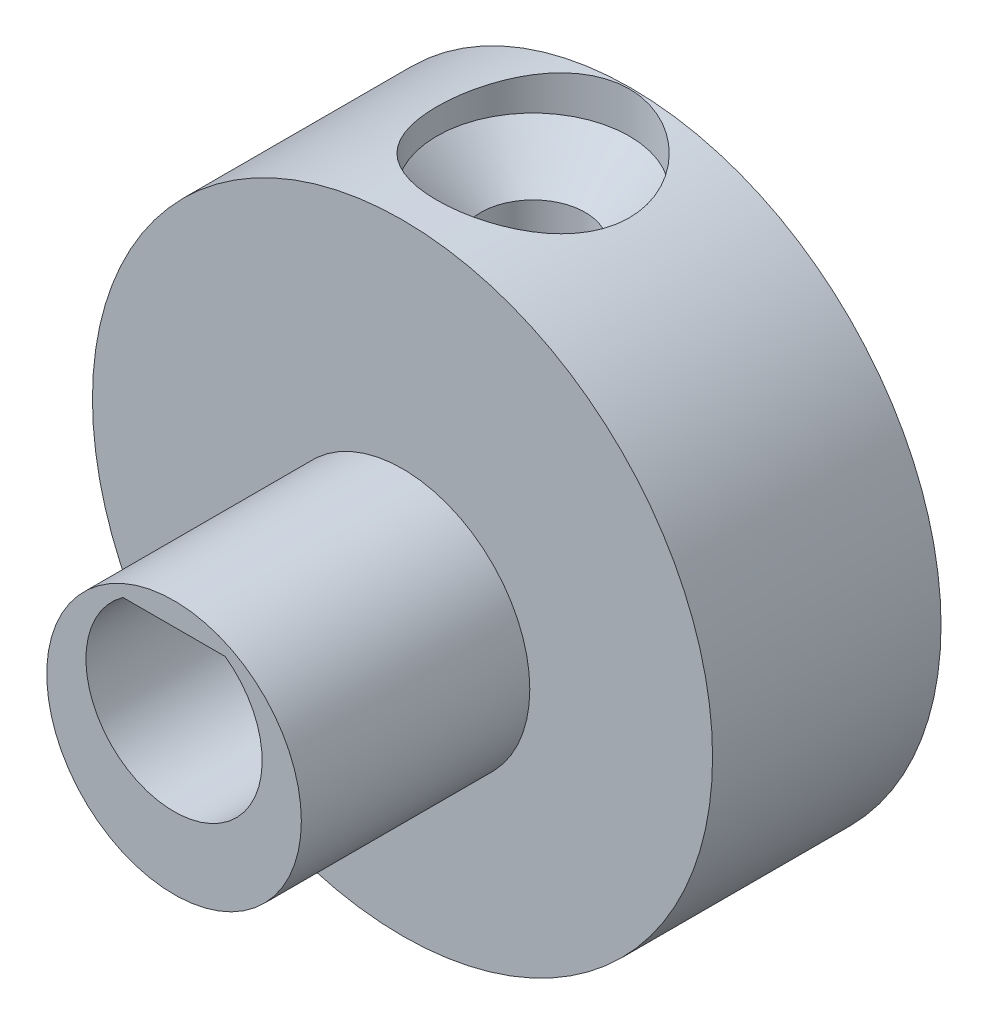
ISO-10303-21;
HEADER;
FILE_DESCRIPTION(('STEP AP214'),'2;1');
FILE_NAME('part.step','',(''),(''),'','','');
FILE_SCHEMA(('AUTOMOTIVE_DESIGN { 1 0 10303 214 1 1 1 1 }'));
ENDSEC;
DATA;
#1=APPLICATION_CONTEXT('core data for automotive mechanical design processes');
#2=APPLICATION_PROTOCOL_DEFINITION('international standard','automotive_design',2000,#1);
#3=PRODUCT_CONTEXT('',#1,'mechanical');
#4=PRODUCT('Part','Part','',(#3));
#5=PRODUCT_RELATED_PRODUCT_CATEGORY('part','',(#4));
#6=PRODUCT_DEFINITION_FORMATION('','',#4);
#7=PRODUCT_DEFINITION_CONTEXT('part definition',#1,'design');
#8=PRODUCT_DEFINITION('design','',#6,#7);
#9=PRODUCT_DEFINITION_SHAPE('','',#8);
#10=(LENGTH_UNIT() NAMED_UNIT(*) SI_UNIT(.MILLI.,.METRE.));
#11=(NAMED_UNIT(*) PLANE_ANGLE_UNIT() SI_UNIT($,.RADIAN.));
#12=(NAMED_UNIT(*) SI_UNIT($,.STERADIAN.) SOLID_ANGLE_UNIT());
#13=UNCERTAINTY_MEASURE_WITH_UNIT(LENGTH_MEASURE(1.E-05),#10,'distance_accuracy_value','');
#14=(GEOMETRIC_REPRESENTATION_CONTEXT(3) GLOBAL_UNCERTAINTY_ASSIGNED_CONTEXT((#13)) GLOBAL_UNIT_ASSIGNED_CONTEXT((#10,
#11,#12)) REPRESENTATION_CONTEXT('',''));
#15=CARTESIAN_POINT('',(0.,0.,0.));
#16=DIRECTION('',(0.,0.,1.));
#17=DIRECTION('',(1.,0.,0.));
#18=AXIS2_PLACEMENT_3D('',#15,#16,#17);
#19=CARTESIAN_POINT('',(0.,0.,7.));
#20=DIRECTION('',(0.,0.,1.));
#21=DIRECTION('',(1.,0.,0.));
#22=AXIS2_PLACEMENT_3D('',#19,#20,#21);
#23=PLANE('',#22);
#24=CARTESIAN_POINT('',(0.,0.,7.));
#25=DIRECTION('',(0.,0.,1.));
#26=DIRECTION('',(1.,0.,0.));
#27=AXIS2_PLACEMENT_3D('',#24,#25,#26);
#28=CIRCLE('',#27,9.5);
#29=CARTESIAN_POINT('',(9.5,0.,7.));
#30=VERTEX_POINT('',#29);
#31=EDGE_CURVE('E239',#30,#30,#28,.T.);
#32=ORIENTED_EDGE('',*,*,#31,.T.);
#33=EDGE_LOOP('',(#32));
#34=FACE_BOUND('',#33,.T.);
#35=CARTESIAN_POINT('',(0.,-1.,7.));
#36=DIRECTION('',(0.,0.,1.));
#37=DIRECTION('',(1.,0.,0.));
#38=AXIS2_PLACEMENT_3D('',#35,#36,#37);
#39=CIRCLE('',#38,3.9);
#40=CARTESIAN_POINT('',(3.9,-1.,7.));
#41=VERTEX_POINT('',#40);
#42=EDGE_CURVE('E121',#41,#41,#39,.T.);
#43=ORIENTED_EDGE('',*,*,#42,.F.);
#44=EDGE_LOOP('',(#43));
#45=FACE_BOUND('',#44,.T.);
#46=ADVANCED_FACE('F37',(#34,#45),#23,.T.);
#47=CARTESIAN_POINT('',(0.,0.,7.));
#48=DIRECTION('',(0.,0.,-1.));
#49=DIRECTION('',(-1.,0.,0.));
#50=AXIS2_PLACEMENT_3D('',#47,#48,#49);
#51=CYLINDRICAL_SURFACE('',#50,9.5);
#52=CARTESIAN_POINT('',(0.,0.,0.));
#53=DIRECTION('',(0.,0.,1.));
#54=DIRECTION('',(1.,0.,0.));
#55=AXIS2_PLACEMENT_3D('',#52,#53,#54);
#56=CIRCLE('',#55,9.5);
#57=CARTESIAN_POINT('',(9.5,0.,0.));
#58=VERTEX_POINT('',#57);
#59=EDGE_CURVE('E243',#58,#58,#56,.T.);
#60=ORIENTED_EDGE('',*,*,#59,.T.);
#61=EDGE_LOOP('',(#60));
#62=FACE_BOUND('',#61,.T.);
#63=ORIENTED_EDGE('',*,*,#31,.F.);
#64=EDGE_LOOP('',(#63));
#65=FACE_BOUND('',#64,.T.);
#66=CARTESIAN_POINT('',(0.,9.5,0.0499999999999993));
#67=CARTESIAN_POINT('',(-0.161567406926282,9.49999909437013,0.0500012053630499));
#68=CARTESIAN_POINT('',(-0.323147279900732,9.49583932646089,0.0633170152733178));
#69=CARTESIAN_POINT('',(-0.641584944667411,9.4796525446316,0.116090940860596));
#70=CARTESIAN_POINT('',(-0.798441604267729,9.46762365987992,0.155555273208378));
#71=CARTESIAN_POINT('',(-1.1027947170735,9.43701334908745,0.259169398645543));
#72=CARTESIAN_POINT('',(-1.25030514697856,9.41844199348971,0.323281266989727));
#73=CARTESIAN_POINT('',(-1.53248201206492,9.3766662966487,0.474210142770418));
#74=CARTESIAN_POINT('',(-1.66714646842867,9.35346124331958,0.561030640603282));
#75=CARTESIAN_POINT('',(-1.92392164602274,9.30409066859077,0.757703607749757));
#76=CARTESIAN_POINT('',(-2.04558497174894,9.27786125549183,0.86812409803955));
#77=CARTESIAN_POINT('',(-2.26899843351921,9.22577001109754,1.10765299045519));
#78=CARTESIAN_POINT('',(-2.37074492095983,9.19990824795588,1.23676480915913));
#79=CARTESIAN_POINT('',(-2.55385091036749,9.15079643620819,1.51387042991636));
#80=CARTESIAN_POINT('',(-2.63465356334744,9.12762533185938,1.66224750371649));
#81=CARTESIAN_POINT('',(-2.76997388856631,9.0874783497526,1.97132013600399));
#82=CARTESIAN_POINT('',(-2.82449838589876,9.07050086363595,2.13201248332678));
#83=CARTESIAN_POINT('',(-2.90408138455997,9.04533128254273,2.45610954895438));
#84=CARTESIAN_POINT('',(-2.92996899453239,9.03689262508304,2.61929099891351));
#85=CARTESIAN_POINT('',(-2.95413341495907,9.02902387054017,2.94788242785283));
#86=CARTESIAN_POINT('',(-2.95241746001743,9.02959141302616,3.11329181155979));
#87=CARTESIAN_POINT('',(-2.92207237656135,9.03945315294141,3.43480411513528));
#88=CARTESIAN_POINT('',(-2.89449475789453,9.0484063790988,3.59101849420595));
#89=CARTESIAN_POINT('',(-2.81491309113067,9.07347713419755,3.89648344363991));
#90=CARTESIAN_POINT('',(-2.7629064768515,9.08959541579385,4.04573328059079));
#91=CARTESIAN_POINT('',(-2.6351954260975,9.12744320307038,4.33554814067386));
#92=CARTESIAN_POINT('',(-2.55915907832293,9.14925050349878,4.47595630717615));
#93=CARTESIAN_POINT('',(-2.38577749205108,9.19598327284839,4.74236659799241));
#94=CARTESIAN_POINT('',(-2.28842677694271,9.2209095424652,4.86836500710723));
#95=CARTESIAN_POINT('',(-2.07001007189237,9.27244196952574,5.10832688880689));
#96=CARTESIAN_POINT('',(-1.94807528955188,9.2990732934929,5.22149560969989));
#97=CARTESIAN_POINT('',(-1.68662683083102,9.35002696614506,5.42597041988933));
#98=CARTESIAN_POINT('',(-1.54711188578235,9.37434914796901,5.51727492997958));
#99=CARTESIAN_POINT('',(-1.25294578630071,9.41819399659606,5.67595898257887));
#100=CARTESIAN_POINT('',(-1.09818748558625,9.43767871491492,5.74315109193124));
#101=CARTESIAN_POINT('',(-0.778819183350298,9.4693793851044,5.85031348531666));
#102=CARTESIAN_POINT('',(-0.61421215015672,9.48159751504087,5.89029192681445));
#103=CARTESIAN_POINT('',(-0.28656667679164,9.49703883611712,5.94054324107595));
#104=CARTESIAN_POINT('',(-0.123708384939485,9.50058770760766,5.95189220732163));
#105=CARTESIAN_POINT('',(0.201601932367692,9.49925262326359,5.94759358362796));
#106=CARTESIAN_POINT('',(0.364054012967164,9.4943698821311,5.93194988239348));
#107=CARTESIAN_POINT('',(0.67980412116065,9.47693408259223,5.87497489716199));
#108=CARTESIAN_POINT('',(0.833228898815433,9.46457179594631,5.83428207522708));
#109=CARTESIAN_POINT('',(1.13103193920231,9.4336206935061,5.7291412739831));
#110=CARTESIAN_POINT('',(1.27540908642626,9.41503111171676,5.66469037218818));
#111=CARTESIAN_POINT('',(1.55490183062599,9.3729797560398,5.51211894904669));
#112=CARTESIAN_POINT('',(1.6897089552774,9.34941101330813,5.42346363383942));
#113=CARTESIAN_POINT('',(1.9428945614532,9.30009814128056,5.22564291445676));
#114=CARTESIAN_POINT('',(2.06126862591042,9.27435343008295,5.1164720143543));
#115=CARTESIAN_POINT('',(2.28303028563283,9.22232431241009,4.87565846835638));
#116=CARTESIAN_POINT('',(2.38565110769751,9.19605815233821,4.74330417602472));
#117=CARTESIAN_POINT('',(2.56729230566239,9.14701551450581,4.46268265243309));
#118=CARTESIAN_POINT('',(2.64631309948734,9.12423897495228,4.31441570302807));
#119=CARTESIAN_POINT('',(2.77801107540274,9.08500886999748,4.00651251503136));
#120=CARTESIAN_POINT('',(2.83079392351569,9.06853000553508,3.84692488633395));
#121=CARTESIAN_POINT('',(2.90855420077247,9.04389344036225,3.52051181246741));
#122=CARTESIAN_POINT('',(2.93354203890362,9.03573262471139,3.35368910110678));
#123=CARTESIAN_POINT('',(2.95426179319509,9.02897791996795,3.02554898737811));
#124=CARTESIAN_POINT('',(2.95125029876885,9.02997309506265,2.86431839924569));
#125=CARTESIAN_POINT('',(2.91908487827771,9.04042161312564,2.54477982436118));
#126=CARTESIAN_POINT('',(2.88993214312725,9.04987457078336,2.38647170480572));
#127=CARTESIAN_POINT('',(2.80714823120982,9.07588821023991,2.07948785820325));
#128=CARTESIAN_POINT('',(2.75387232038773,9.09234553343246,1.93070690918572));
#129=CARTESIAN_POINT('',(2.62463355858462,9.13048834385641,1.64407670566368));
#130=CARTESIAN_POINT('',(2.54866613484505,9.1521748847017,1.50622966163536));
#131=CARTESIAN_POINT('',(2.37276215352555,9.1993796473737,1.23960680207983));
#132=CARTESIAN_POINT('',(2.27201185566098,9.22501366488037,1.11138839752195));
#133=CARTESIAN_POINT('',(2.05083918353012,9.27668784829,0.873271156410551));
#134=CARTESIAN_POINT('',(1.9304115734831,9.30272812061747,0.763377211435582));
#135=CARTESIAN_POINT('',(1.66865147411401,9.35328327344975,0.561500126401841));
#136=CARTESIAN_POINT('',(1.52677209182646,9.37772237221401,0.470205038009916));
#137=CARTESIAN_POINT('',(1.22892069533783,9.42137753490286,0.312884259051782));
#138=CARTESIAN_POINT('',(1.07295442414725,9.44059571462425,0.246848327678644));
#139=CARTESIAN_POINT('',(0.765560445769293,9.47024941398984,0.146897702763779));
#140=CARTESIAN_POINT('',(0.614944492264324,9.48130976925064,0.110664734584473));
#141=CARTESIAN_POINT('',(0.309555624634414,9.49618478460592,0.0622176642378099));
#142=CARTESIAN_POINT('',(0.154783532906983,9.50000086760438,0.0499988452475961));
#143=CARTESIAN_POINT('',(0.,9.5,0.0499999999999993));
#144=B_SPLINE_CURVE_WITH_KNOTS('',3,(#66,#67,#68,#69,#70,#71,#72,#73,#74,#75,#76,#77,#78,#79,
#80,#81,#82,#83,#84,#85,#86,#87,#88,#89,#90,#91,#92,#93,#94,#95,#96,#97,#98,#99,#100,#101,#102,
#103,#104,#105,#106,#107,#108,#109,#110,#111,#112,#113,#114,#115,#116,#117,#118,#119,#120,#121,
#122,#123,#124,#125,#126,#127,#128,#129,#130,#131,#132,#133,#134,#135,#136,#137,#138,#139,#140,
#141,#142,#143),.UNSPECIFIED.,.T.,.F.,(4,2,2,2,2,2,2,2,2,2,2,2,2,2,2,2,2,2,2,2,2,2,2,2,2,2,2,2,
2,2,2,2,2,2,2,2,2,2,4),(0.,0.484133347649746,0.96838183672198,1.45188818389918,1.9354688914219,
2.43235600900798,2.92933406727785,3.43841546523622,3.94736457068723,4.4411578270051,
4.93482166741193,5.40924564801404,5.88371947637557,6.3650566535253,6.8465176530991,
7.34960385933532,7.85272639148277,8.3596792068509,8.86647999298948,9.35392709509123,
9.84130397887705,10.3167451742589,10.7922448732782,11.2792455126031,11.7663768011586,
12.2725515232061,12.7787172810488,13.2828277399315,13.7867493502464,14.2681684586811,
14.7495656362578,15.2240928552618,15.6987157648444,16.1917042316329,16.6848240880873,
17.1937707021137,17.7025107549165,18.1664074932947,18.6302131046672),.UNSPECIFIED.);
#145=CARTESIAN_POINT('',(0.,9.5,0.0499999999999993));
#146=VERTEX_POINT('',#145);
#147=EDGE_CURVE('E114',#146,#146,#144,.T.);
#148=ORIENTED_EDGE('',*,*,#147,.F.);
#149=EDGE_LOOP('',(#148));
#150=FACE_BOUND('',#149,.T.);
#151=ADVANCED_FACE('F175',(#62,#65,#150),#51,.T.);
#152=CARTESIAN_POINT('',(0.,9.501,3.));
#153=DIRECTION('',(0.,-1.,0.));
#154=DIRECTION('',(0.,0.,-1.));
#155=AXIS2_PLACEMENT_3D('',#152,#153,#154);
#156=CYLINDRICAL_SURFACE('',#155,1.6);
#157=CARTESIAN_POINT('',(0.,6.89999999999996,3.));
#158=DIRECTION('',(0.,1.,0.));
#159=DIRECTION('',(0.,0.,1.));
#160=AXIS2_PLACEMENT_3D('',#157,#158,#159);
#161=CIRCLE('',#160,1.6);
#162=CARTESIAN_POINT('',(0.,6.89999999999996,4.6));
#163=VERTEX_POINT('',#162);
#164=EDGE_CURVE('E46',#163,#163,#161,.T.);
#165=ORIENTED_EDGE('',*,*,#164,.T.);
#166=EDGE_LOOP('',(#165));
#167=FACE_BOUND('',#166,.T.);
#168=CARTESIAN_POINT('',(0.,5.6,3.));
#169=DIRECTION('',(0.,1.,0.));
#170=DIRECTION('',(0.,0.,1.));
#171=AXIS2_PLACEMENT_3D('',#168,#169,#170);
#172=CIRCLE('',#171,1.6);
#173=CARTESIAN_POINT('',(0.,5.6,4.6));
#174=VERTEX_POINT('',#173);
#175=EDGE_CURVE('E131',#174,#174,#172,.T.);
#176=ORIENTED_EDGE('',*,*,#175,.F.);
#177=EDGE_LOOP('',(#176));
#178=FACE_BOUND('',#177,.T.);
#179=ADVANCED_FACE('F183',(#167,#178),#156,.F.);
#180=CARTESIAN_POINT('',(0.,2.2,7.));
#181=DIRECTION('',(0.,1.,0.));
#182=DIRECTION('',(0.,0.,1.));
#183=AXIS2_PLACEMENT_3D('',#180,#181,#182);
#184=PLANE('',#183);
#185=DIRECTION('',(0.,0.,-1.));
#186=VECTOR('',#185,1.);
#187=CARTESIAN_POINT('',(1.56524758424985,2.2,7.));
#188=LINE('',#187,#186);
#189=CARTESIAN_POINT('',(1.56524758424985,2.2,2.66833752096446));
#190=VERTEX_POINT('',#189);
#191=CARTESIAN_POINT('',(1.56524758424985,2.2,0.));
#192=VERTEX_POINT('',#191);
#193=EDGE_CURVE('E242',#190,#192,#188,.T.);
#194=ORIENTED_EDGE('',*,*,#193,.F.);
#195=CARTESIAN_POINT('',(0.,2.2,3.));
#196=DIRECTION('',(0.,1.,0.));
#197=DIRECTION('',(0.,0.,1.));
#198=AXIS2_PLACEMENT_3D('',#195,#196,#197);
#199=CIRCLE('',#198,1.6);
#200=CARTESIAN_POINT('',(-1.56524758424985,2.2,2.66833752096446));
#201=VERTEX_POINT('',#200);
#202=EDGE_CURVE('E386',#201,#190,#199,.F.);
#203=ORIENTED_EDGE('',*,*,#202,.F.);
#204=DIRECTION('',(0.,0.,-1.));
#205=VECTOR('',#204,1.);
#206=CARTESIAN_POINT('',(-1.56524758424985,2.2,7.));
#207=LINE('',#206,#205);
#208=CARTESIAN_POINT('',(-1.56524758424985,2.2,0.));
#209=VERTEX_POINT('',#208);
#210=EDGE_CURVE('E115',#201,#209,#207,.T.);
#211=ORIENTED_EDGE('',*,*,#210,.T.);
#212=DIRECTION('',(1.,0.,0.));
#213=VECTOR('',#212,1.);
#214=CARTESIAN_POINT('',(0.,2.2,0.));
#215=LINE('',#214,#213);
#216=EDGE_CURVE('E246',#209,#192,#215,.T.);
#217=ORIENTED_EDGE('',*,*,#216,.T.);
#218=EDGE_LOOP('',(#194,#203,#211,#217));
#219=FACE_BOUND('',#218,.T.);
#220=ADVANCED_FACE('F200',(#219),#184,.F.);
#221=CARTESIAN_POINT('',(0.,0.,7.));
#222=DIRECTION('',(0.,0.,-1.));
#223=DIRECTION('',(-1.,0.,0.));
#224=AXIS2_PLACEMENT_3D('',#221,#222,#223);
#225=CYLINDRICAL_SURFACE('',#224,2.7);
#226=CARTESIAN_POINT('',(-1.56524758424985,2.2,2.66833752096446));
#227=CARTESIAN_POINT('',(-1.57292963429452,2.19452808663043,2.70456186670789));
#228=CARTESIAN_POINT('',(-1.57936917128531,2.18989180592703,2.74118363505691));
#229=CARTESIAN_POINT('',(-1.5897018997922,2.18240605147891,2.81498245276267));
#230=CARTESIAN_POINT('',(-1.59359384556162,2.17955745192049,2.85215976470022));
#231=CARTESIAN_POINT('',(-1.59870735636453,2.1758085620884,2.92599880128177));
#232=CARTESIAN_POINT('',(-1.5999840712512,2.17486803859762,2.96265462539391));
#233=CARTESIAN_POINT('',(-1.60001562405347,2.17484482043315,3.0359488036478));
#234=CARTESIAN_POINT('',(-1.59877177873663,2.17576115571661,3.07258715691501));
#235=CARTESIAN_POINT('',(-1.59372408946355,2.17946217006362,3.14643516984341));
#236=CARTESIAN_POINT('',(-1.58986229458151,2.18228913851785,3.18363870807796));
#237=CARTESIAN_POINT('',(-1.57952635642709,2.18977849818965,3.25792201434403));
#238=CARTESIAN_POINT('',(-1.57302360387628,2.19446097604557,3.29499579154589));
#239=CARTESIAN_POINT('',(-1.56524758424985,2.2,3.33166247903554));
#240=B_SPLINE_CURVE_WITH_KNOTS('',3,(#226,#227,#228,#229,#230,#231,#232,#233,#234,#235,#236,
#237,#238,#239),.UNSPECIFIED.,.F.,.F.,(4,2,2,2,2,2,4),(0.,0.112276021034318,0.224606902990104,
0.334543500973395,0.44442268171029,0.556817184440531,0.670463181993472),.UNSPECIFIED.);
#241=CARTESIAN_POINT('',(-1.56524758424985,2.2,3.33166247903554));
#242=VERTEX_POINT('',#241);
#243=EDGE_CURVE('E112',#201,#242,#240,.T.);
#244=ORIENTED_EDGE('',*,*,#243,.T.);
#245=CARTESIAN_POINT('',(-1.56524758424985,2.2,14.));
#246=VERTEX_POINT('',#245);
#247=EDGE_CURVE('E104',#246,#242,#207,.T.);
#248=ORIENTED_EDGE('',*,*,#247,.F.);
#249=CARTESIAN_POINT('',(0.,0.,14.));
#250=DIRECTION('',(0.,0.,1.));
#251=DIRECTION('',(1.,0.,0.));
#252=AXIS2_PLACEMENT_3D('',#249,#250,#251);
#253=CIRCLE('',#252,2.7);
#254=CARTESIAN_POINT('',(1.56524758424985,2.2,14.));
#255=VERTEX_POINT('',#254);
#256=EDGE_CURVE('E109',#246,#255,#253,.T.);
#257=ORIENTED_EDGE('',*,*,#256,.T.);
#258=CARTESIAN_POINT('',(1.56524758424985,2.2,3.33166247903554));
#259=VERTEX_POINT('',#258);
#260=EDGE_CURVE('E119',#255,#259,#188,.T.);
#261=ORIENTED_EDGE('',*,*,#260,.T.);
#262=CARTESIAN_POINT('',(1.56524758424985,2.2,3.33166247903554));
#263=CARTESIAN_POINT('',(1.57292963429452,2.19452808663043,3.29543813329211));
#264=CARTESIAN_POINT('',(1.57936917128531,2.18989180592703,3.25881636494309));
#265=CARTESIAN_POINT('',(1.5897018997922,2.18240605147891,3.18501754723733));
#266=CARTESIAN_POINT('',(1.59359384556162,2.17955745192049,3.14784023529978));
#267=CARTESIAN_POINT('',(1.59870735636453,2.1758085620884,3.07400119871823));
#268=CARTESIAN_POINT('',(1.5999840712512,2.17486803859762,3.03734537460609));
#269=CARTESIAN_POINT('',(1.60001562405347,2.17484482043315,2.9640511963522));
#270=CARTESIAN_POINT('',(1.59877177873663,2.17576115571661,2.92741284308499));
#271=CARTESIAN_POINT('',(1.59372408946355,2.17946217006362,2.85356483015659));
#272=CARTESIAN_POINT('',(1.58986229458151,2.18228913851785,2.81636129192204));
#273=CARTESIAN_POINT('',(1.57952635642709,2.18977849818965,2.74207798565597));
#274=CARTESIAN_POINT('',(1.57302360387628,2.19446097604557,2.70500420845411));
#275=CARTESIAN_POINT('',(1.56524758424985,2.2,2.66833752096446));
#276=B_SPLINE_CURVE_WITH_KNOTS('',3,(#262,#263,#264,#265,#266,#267,#268,#269,#270,#271,#272,
#273,#274,#275),.UNSPECIFIED.,.F.,.F.,(4,2,2,2,2,2,4),(0.,0.112276021034318,0.224606902990104,
0.334543500973395,0.44442268171029,0.556817184440528,0.670463181993466),.UNSPECIFIED.);
#277=EDGE_CURVE('E53',#259,#190,#276,.T.);
#278=ORIENTED_EDGE('',*,*,#277,.T.);
#279=ORIENTED_EDGE('',*,*,#193,.T.);
#280=CARTESIAN_POINT('',(0.,0.,0.));
#281=DIRECTION('',(0.,0.,1.));
#282=DIRECTION('',(1.,0.,0.));
#283=AXIS2_PLACEMENT_3D('',#280,#281,#282);
#284=CIRCLE('',#283,2.7);
#285=EDGE_CURVE('E233',#209,#192,#284,.T.);
#286=ORIENTED_EDGE('',*,*,#285,.F.);
#287=ORIENTED_EDGE('',*,*,#210,.F.);
#288=EDGE_LOOP('',(#244,#248,#257,#261,#278,#279,#286,#287));
#289=FACE_BOUND('',#288,.T.);
#290=ADVANCED_FACE('F106',(#289),#225,.F.);
#291=ORIENTED_EDGE('',*,*,#247,.T.);
#292=EDGE_CURVE('E134',#259,#242,#199,.F.);
#293=ORIENTED_EDGE('',*,*,#292,.F.);
#294=ORIENTED_EDGE('',*,*,#260,.F.);
#295=DIRECTION('',(-1.,0.,0.));
#296=VECTOR('',#295,1.);
#297=CARTESIAN_POINT('',(-1.56524758424985,2.2,14.));
#298=LINE('',#297,#296);
#299=EDGE_CURVE('E117',#255,#246,#298,.T.);
#300=ORIENTED_EDGE('',*,*,#299,.T.);
#301=EDGE_LOOP('',(#291,#293,#294,#300));
#302=FACE_BOUND('',#301,.T.);
#303=ADVANCED_FACE('F118',(#302),#184,.F.);
#304=CARTESIAN_POINT('',(0.,0.,0.));
#305=DIRECTION('',(0.,0.,1.));
#306=DIRECTION('',(1.,0.,0.));
#307=AXIS2_PLACEMENT_3D('',#304,#305,#306);
#308=PLANE('',#307);
#309=DIRECTION('',(1.,0.,0.));
#310=VECTOR('',#309,1.);
#311=CARTESIAN_POINT('',(2.9,5.6,0.));
#312=LINE('',#311,#310);
#313=CARTESIAN_POINT('',(-2.9,5.6,0.));
#314=VERTEX_POINT('',#313);
#315=CARTESIAN_POINT('',(2.9,5.6,0.));
#316=VERTEX_POINT('',#315);
#317=EDGE_CURVE('E213',#314,#316,#312,.T.);
#318=ORIENTED_EDGE('',*,*,#317,.F.);
#319=DIRECTION('',(0.,1.,0.));
#320=VECTOR('',#319,1.);
#321=CARTESIAN_POINT('',(-2.9,3.2,0.));
#322=LINE('',#321,#320);
#323=CARTESIAN_POINT('',(-2.9,3.2,0.));
#324=VERTEX_POINT('',#323);
#325=EDGE_CURVE('E61',#324,#314,#322,.T.);
#326=ORIENTED_EDGE('',*,*,#325,.F.);
#327=DIRECTION('',(-1.,0.,0.));
#328=VECTOR('',#327,1.);
#329=CARTESIAN_POINT('',(2.9,3.2,0.));
#330=LINE('',#329,#328);
#331=CARTESIAN_POINT('',(2.9,3.2,0.));
#332=VERTEX_POINT('',#331);
#333=EDGE_CURVE('E225',#332,#324,#330,.T.);
#334=ORIENTED_EDGE('',*,*,#333,.F.);
#335=DIRECTION('',(0.,-1.,0.));
#336=VECTOR('',#335,1.);
#337=CARTESIAN_POINT('',(2.9,3.2,0.));
#338=LINE('',#337,#336);
#339=EDGE_CURVE('E219',#316,#332,#338,.T.);
#340=ORIENTED_EDGE('',*,*,#339,.F.);
#341=EDGE_LOOP('',(#318,#326,#334,#340));
#342=FACE_BOUND('',#341,.T.);
#343=ORIENTED_EDGE('',*,*,#285,.T.);
#344=ORIENTED_EDGE('',*,*,#216,.F.);
#345=EDGE_LOOP('',(#343,#344));
#346=FACE_BOUND('',#345,.T.);
#347=ORIENTED_EDGE('',*,*,#59,.F.);
#348=EDGE_LOOP('',(#347));
#349=FACE_BOUND('',#348,.T.);
#350=ADVANCED_FACE('F172',(#342,#346,#349),#308,.F.);
#351=CARTESIAN_POINT('',(-2.9,3.2,6.));
#352=DIRECTION('',(-1.,0.,0.));
#353=DIRECTION('',(0.,0.,1.));
#354=AXIS2_PLACEMENT_3D('',#351,#352,#353);
#355=PLANE('',#354);
#356=ORIENTED_EDGE('',*,*,#325,.T.);
#357=DIRECTION('',(0.,0.,-1.));
#358=VECTOR('',#357,1.);
#359=CARTESIAN_POINT('',(-2.9,5.6,6.));
#360=LINE('',#359,#358);
#361=CARTESIAN_POINT('',(-2.9,5.6,6.));
#362=VERTEX_POINT('',#361);
#363=EDGE_CURVE('E218',#362,#314,#360,.T.);
#364=ORIENTED_EDGE('',*,*,#363,.F.);
#365=DIRECTION('',(0.,1.,0.));
#366=VECTOR('',#365,1.);
#367=CARTESIAN_POINT('',(-2.9,3.2,6.));
#368=LINE('',#367,#366);
#369=CARTESIAN_POINT('',(-2.9,3.2,6.));
#370=VERTEX_POINT('',#369);
#371=EDGE_CURVE('E227',#370,#362,#368,.T.);
#372=ORIENTED_EDGE('',*,*,#371,.F.);
#373=DIRECTION('',(0.,0.,-1.));
#374=VECTOR('',#373,1.);
#375=CARTESIAN_POINT('',(-2.9,3.2,6.));
#376=LINE('',#375,#374);
#377=EDGE_CURVE('E231',#370,#324,#376,.T.);
#378=ORIENTED_EDGE('',*,*,#377,.T.);
#379=EDGE_LOOP('',(#356,#364,#372,#378));
#380=FACE_BOUND('',#379,.T.);
#381=ADVANCED_FACE('F162',(#380),#355,.F.);
#382=CARTESIAN_POINT('',(2.9,3.2,6.));
#383=DIRECTION('',(0.,-1.,0.));
#384=DIRECTION('',(0.,0.,-1.));
#385=AXIS2_PLACEMENT_3D('',#382,#383,#384);
#386=PLANE('',#385);
#387=CARTESIAN_POINT('',(0.,3.2,3.));
#388=DIRECTION('',(0.,1.,0.));
#389=DIRECTION('',(0.,0.,1.));
#390=AXIS2_PLACEMENT_3D('',#387,#388,#389);
#391=CIRCLE('',#390,1.6);
#392=CARTESIAN_POINT('',(0.,3.2,4.6));
#393=VERTEX_POINT('',#392);
#394=EDGE_CURVE('E385',#393,#393,#391,.T.);
#395=ORIENTED_EDGE('',*,*,#394,.F.);
#396=EDGE_LOOP('',(#395));
#397=FACE_BOUND('',#396,.T.);
#398=ORIENTED_EDGE('',*,*,#333,.T.);
#399=ORIENTED_EDGE('',*,*,#377,.F.);
#400=DIRECTION('',(-1.,0.,0.));
#401=VECTOR('',#400,1.);
#402=CARTESIAN_POINT('',(2.9,3.2,6.));
#403=LINE('',#402,#401);
#404=CARTESIAN_POINT('',(2.9,3.2,6.));
#405=VERTEX_POINT('',#404);
#406=EDGE_CURVE('E238',#405,#370,#403,.T.);
#407=ORIENTED_EDGE('',*,*,#406,.F.);
#408=DIRECTION('',(0.,0.,-1.));
#409=VECTOR('',#408,1.);
#410=CARTESIAN_POINT('',(2.9,3.2,6.));
#411=LINE('',#410,#409);
#412=EDGE_CURVE('E234',#405,#332,#411,.T.);
#413=ORIENTED_EDGE('',*,*,#412,.T.);
#414=EDGE_LOOP('',(#398,#399,#407,#413));
#415=FACE_BOUND('',#414,.T.);
#416=ADVANCED_FACE('F158',(#397,#415),#386,.F.);
#417=CARTESIAN_POINT('',(2.9,3.2,6.));
#418=DIRECTION('',(1.,0.,0.));
#419=DIRECTION('',(0.,0.,-1.));
#420=AXIS2_PLACEMENT_3D('',#417,#418,#419);
#421=PLANE('',#420);
#422=ORIENTED_EDGE('',*,*,#339,.T.);
#423=ORIENTED_EDGE('',*,*,#412,.F.);
#424=DIRECTION('',(0.,-1.,0.));
#425=VECTOR('',#424,1.);
#426=CARTESIAN_POINT('',(2.9,3.2,6.));
#427=LINE('',#426,#425);
#428=CARTESIAN_POINT('',(2.9,5.6,6.));
#429=VERTEX_POINT('',#428);
#430=EDGE_CURVE('E394',#429,#405,#427,.T.);
#431=ORIENTED_EDGE('',*,*,#430,.F.);
#432=DIRECTION('',(0.,0.,-1.));
#433=VECTOR('',#432,1.);
#434=CARTESIAN_POINT('',(2.9,5.6,6.));
#435=LINE('',#434,#433);
#436=EDGE_CURVE('E216',#429,#316,#435,.T.);
#437=ORIENTED_EDGE('',*,*,#436,.T.);
#438=EDGE_LOOP('',(#422,#423,#431,#437));
#439=FACE_BOUND('',#438,.T.);
#440=ADVANCED_FACE('F161',(#439),#421,.F.);
#441=CARTESIAN_POINT('',(2.9,5.6,6.));
#442=DIRECTION('',(0.,1.,0.));
#443=DIRECTION('',(0.,0.,1.));
#444=AXIS2_PLACEMENT_3D('',#441,#442,#443);
#445=PLANE('',#444);
#446=ORIENTED_EDGE('',*,*,#175,.T.);
#447=EDGE_LOOP('',(#446));
#448=FACE_BOUND('',#447,.T.);
#449=ORIENTED_EDGE('',*,*,#317,.T.);
#450=ORIENTED_EDGE('',*,*,#436,.F.);
#451=DIRECTION('',(1.,0.,0.));
#452=VECTOR('',#451,1.);
#453=CARTESIAN_POINT('',(2.9,5.6,6.));
#454=LINE('',#453,#452);
#455=EDGE_CURVE('E391',#362,#429,#454,.T.);
#456=ORIENTED_EDGE('',*,*,#455,.F.);
#457=ORIENTED_EDGE('',*,*,#363,.T.);
#458=EDGE_LOOP('',(#449,#450,#456,#457));
#459=FACE_BOUND('',#458,.T.);
#460=ADVANCED_FACE('F156',(#448,#459),#445,.F.);
#461=CARTESIAN_POINT('',(0.,0.,6.));
#462=DIRECTION('',(0.,0.,1.));
#463=DIRECTION('',(1.,0.,0.));
#464=AXIS2_PLACEMENT_3D('',#461,#462,#463);
#465=PLANE('',#464);
#466=ORIENTED_EDGE('',*,*,#371,.T.);
#467=ORIENTED_EDGE('',*,*,#455,.T.);
#468=ORIENTED_EDGE('',*,*,#430,.T.);
#469=ORIENTED_EDGE('',*,*,#406,.T.);
#470=EDGE_LOOP('',(#466,#467,#468,#469));
#471=FACE_BOUND('',#470,.T.);
#472=ADVANCED_FACE('F152',(#471),#465,.F.);
#473=CARTESIAN_POINT('',(0.,-9.501,3.));
#474=DIRECTION('',(0.,1.,0.));
#475=DIRECTION('',(0.,0.,1.));
#476=AXIS2_PLACEMENT_3D('',#473,#474,#475);
#477=CYLINDRICAL_SURFACE('',#476,1.6);
#478=ORIENTED_EDGE('',*,*,#394,.T.);
#479=EDGE_LOOP('',(#478));
#480=FACE_BOUND('',#479,.T.);
#481=ORIENTED_EDGE('',*,*,#202,.T.);
#482=ORIENTED_EDGE('',*,*,#277,.F.);
#483=ORIENTED_EDGE('',*,*,#292,.T.);
#484=ORIENTED_EDGE('',*,*,#243,.F.);
#485=EDGE_LOOP('',(#481,#482,#483,#484));
#486=FACE_BOUND('',#485,.T.);
#487=ADVANCED_FACE('F147',(#480,#486),#477,.F.);
#488=CARTESIAN_POINT('',(0.,9.5,3.));
#489=DIRECTION('',(0.,-1.,0.));
#490=DIRECTION('',(0.,0.,-1.));
#491=AXIS2_PLACEMENT_3D('',#488,#489,#490);
#492=CYLINDRICAL_SURFACE('',#491,2.95);
#493=CARTESIAN_POINT('',(0.,8.24999999999998,3.));
#494=DIRECTION('',(0.,1.,0.));
#495=DIRECTION('',(0.,0.,1.));
#496=AXIS2_PLACEMENT_3D('',#493,#494,#495);
#497=CIRCLE('',#496,2.95);
#498=CARTESIAN_POINT('',(0.,8.24999999999998,5.95));
#499=VERTEX_POINT('',#498);
#500=EDGE_CURVE('E11',#499,#499,#497,.F.);
#501=ORIENTED_EDGE('',*,*,#500,.T.);
#502=EDGE_LOOP('',(#501));
#503=FACE_BOUND('',#502,.T.);
#504=ORIENTED_EDGE('',*,*,#147,.T.);
#505=EDGE_LOOP('',(#504));
#506=FACE_BOUND('',#505,.T.);
#507=ADVANCED_FACE('F192',(#503,#506),#492,.F.);
#508=CARTESIAN_POINT('',(0.,6.89999999999996,3.));
#509=DIRECTION('',(0.,1.,0.));
#510=DIRECTION('',(0.,0.,1.));
#511=AXIS2_PLACEMENT_3D('',#508,#509,#510);
#512=CONICAL_SURFACE('',#511,1.6,0.785398163397443);
#513=ORIENTED_EDGE('',*,*,#500,.F.);
#514=EDGE_LOOP('',(#513));
#515=FACE_BOUND('',#514,.T.);
#516=ORIENTED_EDGE('',*,*,#164,.F.);
#517=EDGE_LOOP('',(#516));
#518=FACE_BOUND('',#517,.T.);
#519=ADVANCED_FACE('F40',(#515,#518),#512,.F.);
#520=CARTESIAN_POINT('',(0.,-1.,14.));
#521=DIRECTION('',(0.,0.,1.));
#522=DIRECTION('',(1.,0.,0.));
#523=AXIS2_PLACEMENT_3D('',#520,#521,#522);
#524=PLANE('',#523);
#525=CARTESIAN_POINT('',(0.,-1.,14.));
#526=DIRECTION('',(0.,0.,1.));
#527=DIRECTION('',(1.,0.,0.));
#528=AXIS2_PLACEMENT_3D('',#525,#526,#527);
#529=CIRCLE('',#528,3.9);
#530=CARTESIAN_POINT('',(3.9,-1.,14.));
#531=VERTEX_POINT('',#530);
#532=EDGE_CURVE('E126',#531,#531,#529,.T.);
#533=ORIENTED_EDGE('',*,*,#532,.T.);
#534=EDGE_LOOP('',(#533));
#535=FACE_BOUND('',#534,.T.);
#536=ORIENTED_EDGE('',*,*,#299,.F.);
#537=ORIENTED_EDGE('',*,*,#256,.F.);
#538=EDGE_LOOP('',(#536,#537));
#539=FACE_BOUND('',#538,.T.);
#540=ADVANCED_FACE('F123',(#535,#539),#524,.T.);
#541=CARTESIAN_POINT('',(0.,-1.,14.));
#542=DIRECTION('',(0.,0.,-1.));
#543=DIRECTION('',(-1.,0.,0.));
#544=AXIS2_PLACEMENT_3D('',#541,#542,#543);
#545=CYLINDRICAL_SURFACE('',#544,3.9);
#546=ORIENTED_EDGE('',*,*,#532,.F.);
#547=EDGE_LOOP('',(#546));
#548=FACE_BOUND('',#547,.T.);
#549=ORIENTED_EDGE('',*,*,#42,.T.);
#550=EDGE_LOOP('',(#549));
#551=FACE_BOUND('',#550,.T.);
#552=ADVANCED_FACE('F197',(#548,#551),#545,.T.);
#553=CLOSED_SHELL('',(#46,#151,#179,#220,#290,#303,#350,#381,#416,#440,#460,#472,#487,#507,#519,
#540,#552));
#554=MANIFOLD_SOLID_BREP('B2',#553);
#555=ADVANCED_BREP_SHAPE_REPRESENTATION('',(#18,#554),#14);
#556=SHAPE_DEFINITION_REPRESENTATION(#9,#555);
ENDSEC;
END-ISO-10303-21;
